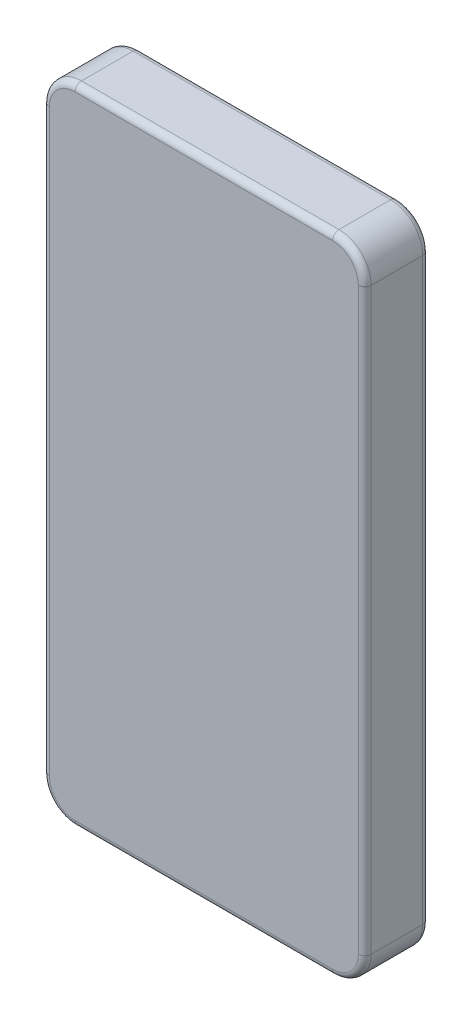
ISO-10303-21;
HEADER;
FILE_DESCRIPTION(('STEP AP214'),'2;1');
FILE_NAME('part.step','',(''),(''),'','','');
FILE_SCHEMA(('AUTOMOTIVE_DESIGN { 1 0 10303 214 1 1 1 1 }'));
ENDSEC;
DATA;
#1=APPLICATION_CONTEXT('core data for automotive mechanical design processes');
#2=APPLICATION_PROTOCOL_DEFINITION('international standard','automotive_design',2000,#1);
#3=PRODUCT_CONTEXT('',#1,'mechanical');
#4=PRODUCT('Part','Part','',(#3));
#5=PRODUCT_RELATED_PRODUCT_CATEGORY('part','',(#4));
#6=PRODUCT_DEFINITION_FORMATION('','',#4);
#7=PRODUCT_DEFINITION_CONTEXT('part definition',#1,'design');
#8=PRODUCT_DEFINITION('design','',#6,#7);
#9=PRODUCT_DEFINITION_SHAPE('','',#8);
#10=(LENGTH_UNIT() NAMED_UNIT(*) SI_UNIT(.MILLI.,.METRE.));
#11=(NAMED_UNIT(*) PLANE_ANGLE_UNIT() SI_UNIT($,.RADIAN.));
#12=(NAMED_UNIT(*) SI_UNIT($,.STERADIAN.) SOLID_ANGLE_UNIT());
#13=UNCERTAINTY_MEASURE_WITH_UNIT(LENGTH_MEASURE(1.E-05),#10,'distance_accuracy_value','');
#14=(GEOMETRIC_REPRESENTATION_CONTEXT(3) GLOBAL_UNCERTAINTY_ASSIGNED_CONTEXT((#13)) GLOBAL_UNIT_ASSIGNED_CONTEXT((#10,
#11,#12)) REPRESENTATION_CONTEXT('',''));
#15=CARTESIAN_POINT('',(0.,0.,0.));
#16=DIRECTION('',(0.,0.,1.));
#17=DIRECTION('',(1.,0.,0.));
#18=AXIS2_PLACEMENT_3D('',#15,#16,#17);
#19=CARTESIAN_POINT('',(-0.25,0.5,0.05));
#20=DIRECTION('',(1.,0.,0.));
#21=DIRECTION('',(0.,1.,0.));
#22=AXIS2_PLACEMENT_3D('',#19,#20,#21);
#23=PLANE('',#22);
#24=DIRECTION('',(0.,0.,-1.));
#25=VECTOR('',#24,1.);
#26=CARTESIAN_POINT('',(-0.25,0.45,0.05));
#27=LINE('',#26,#25);
#28=CARTESIAN_POINT('',(-0.25,0.45,0.04));
#29=VERTEX_POINT('',#28);
#30=CARTESIAN_POINT('',(-0.25,0.45,-0.04));
#31=VERTEX_POINT('',#30);
#32=EDGE_CURVE('E337',#29,#31,#27,.T.);
#33=ORIENTED_EDGE('',*,*,#32,.T.);
#34=DIRECTION('',(0.,-1.,0.));
#35=VECTOR('',#34,1.);
#36=CARTESIAN_POINT('',(-0.25,0.5,-0.04));
#37=LINE('',#36,#35);
#38=CARTESIAN_POINT('',(-0.25,-0.45,-0.04));
#39=VERTEX_POINT('',#38);
#40=EDGE_CURVE('E224',#31,#39,#37,.T.);
#41=ORIENTED_EDGE('',*,*,#40,.T.);
#42=DIRECTION('',(0.,0.,-1.));
#43=VECTOR('',#42,1.);
#44=CARTESIAN_POINT('',(-0.25,-0.45,0.05));
#45=LINE('',#44,#43);
#46=CARTESIAN_POINT('',(-0.25,-0.45,0.04));
#47=VERTEX_POINT('',#46);
#48=EDGE_CURVE('E343',#39,#47,#45,.F.);
#49=ORIENTED_EDGE('',*,*,#48,.T.);
#50=DIRECTION('',(0.,-1.,0.));
#51=VECTOR('',#50,1.);
#52=CARTESIAN_POINT('',(-0.25,0.45,0.04));
#53=LINE('',#52,#51);
#54=EDGE_CURVE('E221',#47,#29,#53,.F.);
#55=ORIENTED_EDGE('',*,*,#54,.T.);
#56=EDGE_LOOP('',(#33,#41,#49,#55));
#57=FACE_BOUND('',#56,.T.);
#58=ADVANCED_FACE('F42',(#57),#23,.F.);
#59=CARTESIAN_POINT('',(-0.25,-0.5,0.05));
#60=DIRECTION('',(0.,1.,0.));
#61=DIRECTION('',(0.,0.,1.));
#62=AXIS2_PLACEMENT_3D('',#59,#60,#61);
#63=PLANE('',#62);
#64=DIRECTION('',(0.,0.,-1.));
#65=VECTOR('',#64,1.);
#66=CARTESIAN_POINT('',(-0.2,-0.5,0.05));
#67=LINE('',#66,#65);
#68=CARTESIAN_POINT('',(-0.2,-0.5,0.04));
#69=VERTEX_POINT('',#68);
#70=CARTESIAN_POINT('',(-0.2,-0.5,-0.04));
#71=VERTEX_POINT('',#70);
#72=EDGE_CURVE('E334',#69,#71,#67,.T.);
#73=ORIENTED_EDGE('',*,*,#72,.T.);
#74=DIRECTION('',(1.,0.,0.));
#75=VECTOR('',#74,1.);
#76=CARTESIAN_POINT('',(-0.25,-0.5,-0.04));
#77=LINE('',#76,#75);
#78=CARTESIAN_POINT('',(0.2,-0.5,-0.04));
#79=VERTEX_POINT('',#78);
#80=EDGE_CURVE('E236',#71,#79,#77,.T.);
#81=ORIENTED_EDGE('',*,*,#80,.T.);
#82=DIRECTION('',(0.,0.,-1.));
#83=VECTOR('',#82,1.);
#84=CARTESIAN_POINT('',(0.2,-0.5,0.05));
#85=LINE('',#84,#83);
#86=CARTESIAN_POINT('',(0.2,-0.5,0.04));
#87=VERTEX_POINT('',#86);
#88=EDGE_CURVE('E282',#79,#87,#85,.F.);
#89=ORIENTED_EDGE('',*,*,#88,.T.);
#90=DIRECTION('',(1.,0.,0.));
#91=VECTOR('',#90,1.);
#92=CARTESIAN_POINT('',(-0.2,-0.5,0.04));
#93=LINE('',#92,#91);
#94=EDGE_CURVE('E233',#87,#69,#93,.F.);
#95=ORIENTED_EDGE('',*,*,#94,.T.);
#96=EDGE_LOOP('',(#73,#81,#89,#95));
#97=FACE_BOUND('',#96,.T.);
#98=ADVANCED_FACE('F331',(#97),#63,.F.);
#99=CARTESIAN_POINT('',(0.25,0.5,0.05));
#100=DIRECTION('',(-1.,0.,0.));
#101=DIRECTION('',(0.,-1.,0.));
#102=AXIS2_PLACEMENT_3D('',#99,#100,#101);
#103=PLANE('',#102);
#104=DIRECTION('',(0.,0.,-1.));
#105=VECTOR('',#104,1.);
#106=CARTESIAN_POINT('',(0.25,-0.45,0.05));
#107=LINE('',#106,#105);
#108=CARTESIAN_POINT('',(0.25,-0.45,0.04));
#109=VERTEX_POINT('',#108);
#110=CARTESIAN_POINT('',(0.25,-0.45,-0.04));
#111=VERTEX_POINT('',#110);
#112=EDGE_CURVE('E328',#109,#111,#107,.T.);
#113=ORIENTED_EDGE('',*,*,#112,.T.);
#114=DIRECTION('',(0.,1.,0.));
#115=VECTOR('',#114,1.);
#116=CARTESIAN_POINT('',(0.25,0.5,-0.04));
#117=LINE('',#116,#115);
#118=CARTESIAN_POINT('',(0.25,0.45,-0.04));
#119=VERTEX_POINT('',#118);
#120=EDGE_CURVE('E199',#111,#119,#117,.T.);
#121=ORIENTED_EDGE('',*,*,#120,.T.);
#122=DIRECTION('',(0.,0.,-1.));
#123=VECTOR('',#122,1.);
#124=CARTESIAN_POINT('',(0.25,0.45,0.05));
#125=LINE('',#124,#123);
#126=CARTESIAN_POINT('',(0.25,0.45,0.04));
#127=VERTEX_POINT('',#126);
#128=EDGE_CURVE('E347',#119,#127,#125,.F.);
#129=ORIENTED_EDGE('',*,*,#128,.T.);
#130=DIRECTION('',(0.,1.,0.));
#131=VECTOR('',#130,1.);
#132=CARTESIAN_POINT('',(0.25,-0.45,0.04));
#133=LINE('',#132,#131);
#134=EDGE_CURVE('E196',#127,#109,#133,.F.);
#135=ORIENTED_EDGE('',*,*,#134,.T.);
#136=EDGE_LOOP('',(#113,#121,#129,#135));
#137=FACE_BOUND('',#136,.T.);
#138=ADVANCED_FACE('F383',(#137),#103,.F.);
#139=CARTESIAN_POINT('',(-0.25,0.5,0.05));
#140=DIRECTION('',(0.,-1.,0.));
#141=DIRECTION('',(0.,0.,-1.));
#142=AXIS2_PLACEMENT_3D('',#139,#140,#141);
#143=PLANE('',#142);
#144=DIRECTION('',(0.,0.,-1.));
#145=VECTOR('',#144,1.);
#146=CARTESIAN_POINT('',(0.2,0.5,0.05));
#147=LINE('',#146,#145);
#148=CARTESIAN_POINT('',(0.2,0.5,0.04));
#149=VERTEX_POINT('',#148);
#150=CARTESIAN_POINT('',(0.2,0.5,-0.04));
#151=VERTEX_POINT('',#150);
#152=EDGE_CURVE('E353',#149,#151,#147,.T.);
#153=ORIENTED_EDGE('',*,*,#152,.T.);
#154=DIRECTION('',(-1.,0.,0.));
#155=VECTOR('',#154,1.);
#156=CARTESIAN_POINT('',(-0.25,0.5,-0.04));
#157=LINE('',#156,#155);
#158=CARTESIAN_POINT('',(-0.2,0.5,-0.04));
#159=VERTEX_POINT('',#158);
#160=EDGE_CURVE('E211',#151,#159,#157,.T.);
#161=ORIENTED_EDGE('',*,*,#160,.T.);
#162=DIRECTION('',(0.,0.,-1.));
#163=VECTOR('',#162,1.);
#164=CARTESIAN_POINT('',(-0.2,0.5,0.05));
#165=LINE('',#164,#163);
#166=CARTESIAN_POINT('',(-0.2,0.5,0.04));
#167=VERTEX_POINT('',#166);
#168=EDGE_CURVE('E178',#159,#167,#165,.F.);
#169=ORIENTED_EDGE('',*,*,#168,.T.);
#170=DIRECTION('',(-1.,0.,0.));
#171=VECTOR('',#170,1.);
#172=CARTESIAN_POINT('',(0.2,0.5,0.04));
#173=LINE('',#172,#171);
#174=EDGE_CURVE('E208',#167,#149,#173,.F.);
#175=ORIENTED_EDGE('',*,*,#174,.T.);
#176=EDGE_LOOP('',(#153,#161,#169,#175));
#177=FACE_BOUND('',#176,.T.);
#178=ADVANCED_FACE('F426',(#177),#143,.F.);
#179=CARTESIAN_POINT('',(0.,0.,0.05));
#180=DIRECTION('',(0.,0.,1.));
#181=DIRECTION('',(1.,0.,0.));
#182=AXIS2_PLACEMENT_3D('',#179,#180,#181);
#183=PLANE('',#182);
#184=DIRECTION('',(-1.,0.,0.));
#185=VECTOR('',#184,1.);
#186=CARTESIAN_POINT('',(-0.2,0.49,0.05));
#187=LINE('',#186,#185);
#188=CARTESIAN_POINT('',(0.2,0.49,0.05));
#189=VERTEX_POINT('',#188);
#190=CARTESIAN_POINT('',(-0.2,0.49,0.05));
#191=VERTEX_POINT('',#190);
#192=EDGE_CURVE('E52',#189,#191,#187,.T.);
#193=ORIENTED_EDGE('',*,*,#192,.T.);
#194=CARTESIAN_POINT('',(-0.2,0.45,0.05));
#195=DIRECTION('',(0.,0.,1.));
#196=DIRECTION('',(1.,0.,0.));
#197=AXIS2_PLACEMENT_3D('',#194,#195,#196);
#198=CIRCLE('',#197,0.04);
#199=CARTESIAN_POINT('',(-0.24,0.45,0.05));
#200=VERTEX_POINT('',#199);
#201=EDGE_CURVE('E11',#191,#200,#198,.T.);
#202=ORIENTED_EDGE('',*,*,#201,.T.);
#203=DIRECTION('',(0.,-1.,0.));
#204=VECTOR('',#203,1.);
#205=CARTESIAN_POINT('',(-0.24,-0.45,0.05));
#206=LINE('',#205,#204);
#207=CARTESIAN_POINT('',(-0.24,-0.45,0.05));
#208=VERTEX_POINT('',#207);
#209=EDGE_CURVE('E239',#200,#208,#206,.T.);
#210=ORIENTED_EDGE('',*,*,#209,.T.);
#211=CARTESIAN_POINT('',(-0.2,-0.45,0.05));
#212=DIRECTION('',(0.,0.,1.));
#213=DIRECTION('',(1.,0.,0.));
#214=AXIS2_PLACEMENT_3D('',#211,#212,#213);
#215=CIRCLE('',#214,0.04);
#216=CARTESIAN_POINT('',(-0.2,-0.49,0.05));
#217=VERTEX_POINT('',#216);
#218=EDGE_CURVE('E242',#208,#217,#215,.T.);
#219=ORIENTED_EDGE('',*,*,#218,.T.);
#220=DIRECTION('',(1.,0.,0.));
#221=VECTOR('',#220,1.);
#222=CARTESIAN_POINT('',(0.2,-0.49,0.05));
#223=LINE('',#222,#221);
#224=CARTESIAN_POINT('',(0.2,-0.49,0.05));
#225=VERTEX_POINT('',#224);
#226=EDGE_CURVE('E245',#217,#225,#223,.T.);
#227=ORIENTED_EDGE('',*,*,#226,.T.);
#228=CARTESIAN_POINT('',(0.2,-0.45,0.05));
#229=DIRECTION('',(0.,0.,1.));
#230=DIRECTION('',(1.,0.,0.));
#231=AXIS2_PLACEMENT_3D('',#228,#229,#230);
#232=CIRCLE('',#231,0.04);
#233=CARTESIAN_POINT('',(0.24,-0.45,0.05));
#234=VERTEX_POINT('',#233);
#235=EDGE_CURVE('E248',#225,#234,#232,.T.);
#236=ORIENTED_EDGE('',*,*,#235,.T.);
#237=DIRECTION('',(0.,1.,0.));
#238=VECTOR('',#237,1.);
#239=CARTESIAN_POINT('',(0.24,0.45,0.05));
#240=LINE('',#239,#238);
#241=CARTESIAN_POINT('',(0.24,0.45,0.05));
#242=VERTEX_POINT('',#241);
#243=EDGE_CURVE('E251',#234,#242,#240,.T.);
#244=ORIENTED_EDGE('',*,*,#243,.T.);
#245=CARTESIAN_POINT('',(0.2,0.45,0.05));
#246=DIRECTION('',(0.,0.,1.));
#247=DIRECTION('',(1.,0.,0.));
#248=AXIS2_PLACEMENT_3D('',#245,#246,#247);
#249=CIRCLE('',#248,0.04);
#250=EDGE_CURVE('E63',#242,#189,#249,.T.);
#251=ORIENTED_EDGE('',*,*,#250,.T.);
#252=EDGE_LOOP('',(#193,#202,#210,#219,#227,#236,#244,#251));
#253=FACE_BOUND('',#252,.T.);
#254=ADVANCED_FACE('F399',(#253),#183,.T.);
#255=CARTESIAN_POINT('',(0.,0.,-0.05));
#256=DIRECTION('',(0.,0.,1.));
#257=DIRECTION('',(1.,0.,0.));
#258=AXIS2_PLACEMENT_3D('',#255,#256,#257);
#259=PLANE('',#258);
#260=DIRECTION('',(0.,1.,0.));
#261=VECTOR('',#260,1.);
#262=CARTESIAN_POINT('',(0.24,0.,-0.05));
#263=LINE('',#262,#261);
#264=CARTESIAN_POINT('',(0.24,0.45,-0.05));
#265=VERTEX_POINT('',#264);
#266=CARTESIAN_POINT('',(0.24,-0.45,-0.05));
#267=VERTEX_POINT('',#266);
#268=EDGE_CURVE('E182',#265,#267,#263,.F.);
#269=ORIENTED_EDGE('',*,*,#268,.T.);
#270=CARTESIAN_POINT('',(0.2,-0.45,-0.05));
#271=DIRECTION('',(0.,0.,1.));
#272=DIRECTION('',(1.,0.,0.));
#273=AXIS2_PLACEMENT_3D('',#270,#271,#272);
#274=CIRCLE('',#273,0.04);
#275=CARTESIAN_POINT('',(0.2,-0.49,-0.05));
#276=VERTEX_POINT('',#275);
#277=EDGE_CURVE('E161',#267,#276,#274,.F.);
#278=ORIENTED_EDGE('',*,*,#277,.T.);
#279=DIRECTION('',(1.,0.,0.));
#280=VECTOR('',#279,1.);
#281=CARTESIAN_POINT('',(0.,-0.49,-0.05));
#282=LINE('',#281,#280);
#283=CARTESIAN_POINT('',(-0.2,-0.49,-0.05));
#284=VERTEX_POINT('',#283);
#285=EDGE_CURVE('E170',#276,#284,#282,.F.);
#286=ORIENTED_EDGE('',*,*,#285,.T.);
#287=CARTESIAN_POINT('',(-0.2,-0.45,-0.05));
#288=DIRECTION('',(0.,0.,1.));
#289=DIRECTION('',(1.,0.,0.));
#290=AXIS2_PLACEMENT_3D('',#287,#288,#289);
#291=CIRCLE('',#290,0.04);
#292=CARTESIAN_POINT('',(-0.24,-0.45,-0.05));
#293=VERTEX_POINT('',#292);
#294=EDGE_CURVE('E177',#284,#293,#291,.F.);
#295=ORIENTED_EDGE('',*,*,#294,.T.);
#296=DIRECTION('',(0.,-1.,0.));
#297=VECTOR('',#296,1.);
#298=CARTESIAN_POINT('',(-0.24,0.,-0.05));
#299=LINE('',#298,#297);
#300=CARTESIAN_POINT('',(-0.24,0.45,-0.05));
#301=VERTEX_POINT('',#300);
#302=EDGE_CURVE('E362',#293,#301,#299,.F.);
#303=ORIENTED_EDGE('',*,*,#302,.T.);
#304=CARTESIAN_POINT('',(-0.2,0.45,-0.05));
#305=DIRECTION('',(0.,0.,1.));
#306=DIRECTION('',(1.,0.,0.));
#307=AXIS2_PLACEMENT_3D('',#304,#305,#306);
#308=CIRCLE('',#307,0.04);
#309=CARTESIAN_POINT('',(-0.2,0.49,-0.05));
#310=VERTEX_POINT('',#309);
#311=EDGE_CURVE('E365',#301,#310,#308,.F.);
#312=ORIENTED_EDGE('',*,*,#311,.T.);
#313=DIRECTION('',(-1.,0.,0.));
#314=VECTOR('',#313,1.);
#315=CARTESIAN_POINT('',(0.,0.49,-0.05));
#316=LINE('',#315,#314);
#317=CARTESIAN_POINT('',(0.2,0.49,-0.05));
#318=VERTEX_POINT('',#317);
#319=EDGE_CURVE('E368',#310,#318,#316,.F.);
#320=ORIENTED_EDGE('',*,*,#319,.T.);
#321=CARTESIAN_POINT('',(0.2,0.45,-0.05));
#322=DIRECTION('',(0.,0.,1.));
#323=DIRECTION('',(1.,0.,0.));
#324=AXIS2_PLACEMENT_3D('',#321,#322,#323);
#325=CIRCLE('',#324,0.04);
#326=EDGE_CURVE('E190',#318,#265,#325,.F.);
#327=ORIENTED_EDGE('',*,*,#326,.T.);
#328=EDGE_LOOP('',(#269,#278,#286,#295,#303,#312,#320,#327));
#329=FACE_BOUND('',#328,.T.);
#330=ADVANCED_FACE('F180',(#329),#259,.F.);
#331=CARTESIAN_POINT('',(-0.2,-0.45,0.05));
#332=DIRECTION('',(0.,0.,-1.));
#333=DIRECTION('',(-1.,0.,0.));
#334=AXIS2_PLACEMENT_3D('',#331,#332,#333);
#335=CYLINDRICAL_SURFACE('',#334,0.05);
#336=ORIENTED_EDGE('',*,*,#48,.F.);
#337=CARTESIAN_POINT('',(-0.2,-0.45,-0.04));
#338=DIRECTION('',(0.,0.,1.));
#339=DIRECTION('',(1.,0.,0.));
#340=AXIS2_PLACEMENT_3D('',#337,#338,#339);
#341=CIRCLE('',#340,0.05);
#342=EDGE_CURVE('E230',#39,#71,#341,.T.);
#343=ORIENTED_EDGE('',*,*,#342,.T.);
#344=ORIENTED_EDGE('',*,*,#72,.F.);
#345=CARTESIAN_POINT('',(-0.2,-0.45,0.04));
#346=DIRECTION('',(0.,0.,1.));
#347=DIRECTION('',(1.,0.,0.));
#348=AXIS2_PLACEMENT_3D('',#345,#346,#347);
#349=CIRCLE('',#348,0.05);
#350=EDGE_CURVE('E227',#69,#47,#349,.F.);
#351=ORIENTED_EDGE('',*,*,#350,.T.);
#352=EDGE_LOOP('',(#336,#343,#344,#351));
#353=FACE_BOUND('',#352,.T.);
#354=ADVANCED_FACE('F443',(#353),#335,.T.);
#355=CARTESIAN_POINT('',(0.2,-0.45,0.05));
#356=DIRECTION('',(0.,0.,-1.));
#357=DIRECTION('',(-1.,0.,0.));
#358=AXIS2_PLACEMENT_3D('',#355,#356,#357);
#359=CYLINDRICAL_SURFACE('',#358,0.05);
#360=ORIENTED_EDGE('',*,*,#88,.F.);
#361=CARTESIAN_POINT('',(0.2,-0.45,-0.04));
#362=DIRECTION('',(0.,0.,1.));
#363=DIRECTION('',(1.,0.,0.));
#364=AXIS2_PLACEMENT_3D('',#361,#362,#363);
#365=CIRCLE('',#364,0.05);
#366=EDGE_CURVE('E163',#79,#111,#365,.T.);
#367=ORIENTED_EDGE('',*,*,#366,.T.);
#368=ORIENTED_EDGE('',*,*,#112,.F.);
#369=CARTESIAN_POINT('',(0.2,-0.45,0.04));
#370=DIRECTION('',(0.,0.,1.));
#371=DIRECTION('',(1.,0.,0.));
#372=AXIS2_PLACEMENT_3D('',#369,#370,#371);
#373=CIRCLE('',#372,0.05);
#374=EDGE_CURVE('E185',#109,#87,#373,.F.);
#375=ORIENTED_EDGE('',*,*,#374,.T.);
#376=EDGE_LOOP('',(#360,#367,#368,#375));
#377=FACE_BOUND('',#376,.T.);
#378=ADVANCED_FACE('F326',(#377),#359,.T.);
#379=CARTESIAN_POINT('',(-0.2,0.45,0.05));
#380=DIRECTION('',(0.,0.,-1.));
#381=DIRECTION('',(-1.,0.,0.));
#382=AXIS2_PLACEMENT_3D('',#379,#380,#381);
#383=CYLINDRICAL_SURFACE('',#382,0.05);
#384=ORIENTED_EDGE('',*,*,#168,.F.);
#385=CARTESIAN_POINT('',(-0.2,0.45,-0.04));
#386=DIRECTION('',(0.,0.,1.));
#387=DIRECTION('',(1.,0.,0.));
#388=AXIS2_PLACEMENT_3D('',#385,#386,#387);
#389=CIRCLE('',#388,0.05);
#390=EDGE_CURVE('E218',#159,#31,#389,.T.);
#391=ORIENTED_EDGE('',*,*,#390,.T.);
#392=ORIENTED_EDGE('',*,*,#32,.F.);
#393=CARTESIAN_POINT('',(-0.2,0.45,0.04));
#394=DIRECTION('',(0.,0.,1.));
#395=DIRECTION('',(1.,0.,0.));
#396=AXIS2_PLACEMENT_3D('',#393,#394,#395);
#397=CIRCLE('',#396,0.05);
#398=EDGE_CURVE('E214',#29,#167,#397,.F.);
#399=ORIENTED_EDGE('',*,*,#398,.T.);
#400=EDGE_LOOP('',(#384,#391,#392,#399));
#401=FACE_BOUND('',#400,.T.);
#402=ADVANCED_FACE('F415',(#401),#383,.T.);
#403=CARTESIAN_POINT('',(0.2,0.45,0.05));
#404=DIRECTION('',(0.,0.,-1.));
#405=DIRECTION('',(-1.,0.,0.));
#406=AXIS2_PLACEMENT_3D('',#403,#404,#405);
#407=CYLINDRICAL_SURFACE('',#406,0.05);
#408=ORIENTED_EDGE('',*,*,#128,.F.);
#409=CARTESIAN_POINT('',(0.2,0.45,-0.04));
#410=DIRECTION('',(0.,0.,1.));
#411=DIRECTION('',(1.,0.,0.));
#412=AXIS2_PLACEMENT_3D('',#409,#410,#411);
#413=CIRCLE('',#412,0.05);
#414=EDGE_CURVE('E205',#119,#151,#413,.T.);
#415=ORIENTED_EDGE('',*,*,#414,.T.);
#416=ORIENTED_EDGE('',*,*,#152,.F.);
#417=CARTESIAN_POINT('',(0.2,0.45,0.04));
#418=DIRECTION('',(0.,0.,1.));
#419=DIRECTION('',(1.,0.,0.));
#420=AXIS2_PLACEMENT_3D('',#417,#418,#419);
#421=CIRCLE('',#420,0.05);
#422=EDGE_CURVE('E202',#149,#127,#421,.F.);
#423=ORIENTED_EDGE('',*,*,#422,.T.);
#424=EDGE_LOOP('',(#408,#415,#416,#423));
#425=FACE_BOUND('',#424,.T.);
#426=ADVANCED_FACE('F385',(#425),#407,.T.);
#427=CARTESIAN_POINT('',(-0.2,0.45,-0.04));
#428=DIRECTION('',(0.,0.,1.));
#429=DIRECTION('',(1.,0.,0.));
#430=AXIS2_PLACEMENT_3D('',#427,#428,#429);
#431=TOROIDAL_SURFACE('',#430,0.04,0.01);
#432=CARTESIAN_POINT('',(-0.24,0.45,-0.04));
#433=DIRECTION('',(0.,-1.,0.));
#434=DIRECTION('',(0.,0.,-1.));
#435=AXIS2_PLACEMENT_3D('',#432,#433,#434);
#436=CIRCLE('',#435,0.01);
#437=EDGE_CURVE('E274',#31,#301,#436,.T.);
#438=ORIENTED_EDGE('',*,*,#437,.F.);
#439=ORIENTED_EDGE('',*,*,#390,.F.);
#440=CARTESIAN_POINT('',(-0.2,0.49,-0.04));
#441=DIRECTION('',(1.,0.,0.));
#442=DIRECTION('',(0.,0.,-1.));
#443=AXIS2_PLACEMENT_3D('',#440,#441,#442);
#444=CIRCLE('',#443,0.01);
#445=EDGE_CURVE('E278',#310,#159,#444,.T.);
#446=ORIENTED_EDGE('',*,*,#445,.F.);
#447=ORIENTED_EDGE('',*,*,#311,.F.);
#448=EDGE_LOOP('',(#438,#439,#446,#447));
#449=FACE_BOUND('',#448,.T.);
#450=ADVANCED_FACE('F419',(#449),#431,.T.);
#451=CARTESIAN_POINT('',(-0.25,0.49,-0.04));
#452=DIRECTION('',(-1.,0.,0.));
#453=DIRECTION('',(0.,0.,1.));
#454=AXIS2_PLACEMENT_3D('',#451,#452,#453);
#455=CYLINDRICAL_SURFACE('',#454,0.01);
#456=ORIENTED_EDGE('',*,*,#445,.T.);
#457=ORIENTED_EDGE('',*,*,#160,.F.);
#458=CARTESIAN_POINT('',(0.2,0.49,-0.04));
#459=DIRECTION('',(1.,0.,0.));
#460=DIRECTION('',(0.,0.,-1.));
#461=AXIS2_PLACEMENT_3D('',#458,#459,#460);
#462=CIRCLE('',#461,0.01);
#463=EDGE_CURVE('E270',#318,#151,#462,.T.);
#464=ORIENTED_EDGE('',*,*,#463,.F.);
#465=ORIENTED_EDGE('',*,*,#319,.F.);
#466=EDGE_LOOP('',(#456,#457,#464,#465));
#467=FACE_BOUND('',#466,.T.);
#468=ADVANCED_FACE('F424',(#467),#455,.T.);
#469=CARTESIAN_POINT('',(-0.24,0.5,-0.04));
#470=DIRECTION('',(0.,-1.,0.));
#471=DIRECTION('',(1.,0.,0.));
#472=AXIS2_PLACEMENT_3D('',#469,#470,#471);
#473=CYLINDRICAL_SURFACE('',#472,0.01);
#474=ORIENTED_EDGE('',*,*,#437,.T.);
#475=ORIENTED_EDGE('',*,*,#302,.F.);
#476=CARTESIAN_POINT('',(-0.24,-0.45,-0.04));
#477=DIRECTION('',(0.,-1.,0.));
#478=DIRECTION('',(0.,0.,-1.));
#479=AXIS2_PLACEMENT_3D('',#476,#477,#478);
#480=CIRCLE('',#479,0.01);
#481=EDGE_CURVE('E266',#39,#293,#480,.T.);
#482=ORIENTED_EDGE('',*,*,#481,.F.);
#483=ORIENTED_EDGE('',*,*,#40,.F.);
#484=EDGE_LOOP('',(#474,#475,#482,#483));
#485=FACE_BOUND('',#484,.T.);
#486=ADVANCED_FACE('F465',(#485),#473,.T.);
#487=CARTESIAN_POINT('',(0.2,0.45,-0.04));
#488=DIRECTION('',(0.,0.,1.));
#489=DIRECTION('',(1.,0.,0.));
#490=AXIS2_PLACEMENT_3D('',#487,#488,#489);
#491=TOROIDAL_SURFACE('',#490,0.04,0.01);
#492=ORIENTED_EDGE('',*,*,#463,.T.);
#493=ORIENTED_EDGE('',*,*,#414,.F.);
#494=CARTESIAN_POINT('',(0.24,0.45,-0.04));
#495=DIRECTION('',(0.,-1.,0.));
#496=DIRECTION('',(0.,0.,-1.));
#497=AXIS2_PLACEMENT_3D('',#494,#495,#496);
#498=CIRCLE('',#497,0.01);
#499=EDGE_CURVE('E262',#265,#119,#498,.T.);
#500=ORIENTED_EDGE('',*,*,#499,.F.);
#501=ORIENTED_EDGE('',*,*,#326,.F.);
#502=EDGE_LOOP('',(#492,#493,#500,#501));
#503=FACE_BOUND('',#502,.T.);
#504=ADVANCED_FACE('F377',(#503),#491,.T.);
#505=CARTESIAN_POINT('',(-0.2,-0.45,-0.04));
#506=DIRECTION('',(0.,0.,1.));
#507=DIRECTION('',(1.,0.,0.));
#508=AXIS2_PLACEMENT_3D('',#505,#506,#507);
#509=TOROIDAL_SURFACE('',#508,0.04,0.01);
#510=ORIENTED_EDGE('',*,*,#481,.T.);
#511=ORIENTED_EDGE('',*,*,#294,.F.);
#512=CARTESIAN_POINT('',(-0.2,-0.49,-0.04));
#513=DIRECTION('',(1.,0.,0.));
#514=DIRECTION('',(0.,0.,-1.));
#515=AXIS2_PLACEMENT_3D('',#512,#513,#514);
#516=CIRCLE('',#515,0.01);
#517=EDGE_CURVE('E173',#71,#284,#516,.T.);
#518=ORIENTED_EDGE('',*,*,#517,.F.);
#519=ORIENTED_EDGE('',*,*,#342,.F.);
#520=EDGE_LOOP('',(#510,#511,#518,#519));
#521=FACE_BOUND('',#520,.T.);
#522=ADVANCED_FACE('F459',(#521),#509,.T.);
#523=CARTESIAN_POINT('',(0.24,0.5,-0.04));
#524=DIRECTION('',(0.,1.,0.));
#525=DIRECTION('',(-1.,0.,0.));
#526=AXIS2_PLACEMENT_3D('',#523,#524,#525);
#527=CYLINDRICAL_SURFACE('',#526,0.01);
#528=ORIENTED_EDGE('',*,*,#499,.T.);
#529=ORIENTED_EDGE('',*,*,#120,.F.);
#530=CARTESIAN_POINT('',(0.24,-0.45,-0.04));
#531=DIRECTION('',(0.,-1.,0.));
#532=DIRECTION('',(0.,0.,-1.));
#533=AXIS2_PLACEMENT_3D('',#530,#531,#532);
#534=CIRCLE('',#533,0.01);
#535=EDGE_CURVE('E167',#267,#111,#534,.T.);
#536=ORIENTED_EDGE('',*,*,#535,.F.);
#537=ORIENTED_EDGE('',*,*,#268,.F.);
#538=EDGE_LOOP('',(#528,#529,#536,#537));
#539=FACE_BOUND('',#538,.T.);
#540=ADVANCED_FACE('F380',(#539),#527,.T.);
#541=CARTESIAN_POINT('',(-0.25,-0.49,-0.04));
#542=DIRECTION('',(1.,0.,0.));
#543=DIRECTION('',(0.,0.,-1.));
#544=AXIS2_PLACEMENT_3D('',#541,#542,#543);
#545=CYLINDRICAL_SURFACE('',#544,0.01);
#546=ORIENTED_EDGE('',*,*,#517,.T.);
#547=ORIENTED_EDGE('',*,*,#285,.F.);
#548=CARTESIAN_POINT('',(0.2,-0.49,-0.04));
#549=DIRECTION('',(1.,0.,0.));
#550=DIRECTION('',(0.,0.,-1.));
#551=AXIS2_PLACEMENT_3D('',#548,#549,#550);
#552=CIRCLE('',#551,0.01);
#553=EDGE_CURVE('E157',#79,#276,#552,.T.);
#554=ORIENTED_EDGE('',*,*,#553,.F.);
#555=ORIENTED_EDGE('',*,*,#80,.F.);
#556=EDGE_LOOP('',(#546,#547,#554,#555));
#557=FACE_BOUND('',#556,.T.);
#558=ADVANCED_FACE('F171',(#557),#545,.T.);
#559=CARTESIAN_POINT('',(0.2,-0.45,-0.04));
#560=DIRECTION('',(0.,0.,1.));
#561=DIRECTION('',(1.,0.,0.));
#562=AXIS2_PLACEMENT_3D('',#559,#560,#561);
#563=TOROIDAL_SURFACE('',#562,0.04,0.01);
#564=ORIENTED_EDGE('',*,*,#535,.T.);
#565=ORIENTED_EDGE('',*,*,#366,.F.);
#566=ORIENTED_EDGE('',*,*,#553,.T.);
#567=ORIENTED_EDGE('',*,*,#277,.F.);
#568=EDGE_LOOP('',(#564,#565,#566,#567));
#569=FACE_BOUND('',#568,.T.);
#570=ADVANCED_FACE('F159',(#569),#563,.T.);
#571=CARTESIAN_POINT('',(0.2,-0.45,0.04));
#572=DIRECTION('',(0.,0.,1.));
#573=DIRECTION('',(1.,0.,0.));
#574=AXIS2_PLACEMENT_3D('',#571,#572,#573);
#575=TOROIDAL_SURFACE('',#574,0.04,0.01);
#576=CARTESIAN_POINT('',(0.2,-0.49,0.04));
#577=DIRECTION('',(-1.,0.,0.));
#578=DIRECTION('',(0.,0.,1.));
#579=AXIS2_PLACEMENT_3D('',#576,#577,#578);
#580=CIRCLE('',#579,0.01);
#581=EDGE_CURVE('E304',#87,#225,#580,.T.);
#582=ORIENTED_EDGE('',*,*,#581,.F.);
#583=ORIENTED_EDGE('',*,*,#374,.F.);
#584=CARTESIAN_POINT('',(0.24,-0.45,0.04));
#585=DIRECTION('',(0.,1.,0.));
#586=DIRECTION('',(0.,0.,1.));
#587=AXIS2_PLACEMENT_3D('',#584,#585,#586);
#588=CIRCLE('',#587,0.01);
#589=EDGE_CURVE('E46',#234,#109,#588,.T.);
#590=ORIENTED_EDGE('',*,*,#589,.F.);
#591=ORIENTED_EDGE('',*,*,#235,.F.);
#592=EDGE_LOOP('',(#582,#583,#590,#591));
#593=FACE_BOUND('',#592,.T.);
#594=ADVANCED_FACE('F44',(#593),#575,.T.);
#595=CARTESIAN_POINT('',(0.24,0.,0.04));
#596=DIRECTION('',(0.,-1.,0.));
#597=DIRECTION('',(1.,0.,0.));
#598=AXIS2_PLACEMENT_3D('',#595,#596,#597);
#599=CYLINDRICAL_SURFACE('',#598,0.01);
#600=ORIENTED_EDGE('',*,*,#589,.T.);
#601=ORIENTED_EDGE('',*,*,#134,.F.);
#602=CARTESIAN_POINT('',(0.24,0.45,0.04));
#603=DIRECTION('',(0.,1.,0.));
#604=DIRECTION('',(0.,0.,1.));
#605=AXIS2_PLACEMENT_3D('',#602,#603,#604);
#606=CIRCLE('',#605,0.01);
#607=EDGE_CURVE('E301',#242,#127,#606,.T.);
#608=ORIENTED_EDGE('',*,*,#607,.F.);
#609=ORIENTED_EDGE('',*,*,#243,.F.);
#610=EDGE_LOOP('',(#600,#601,#608,#609));
#611=FACE_BOUND('',#610,.T.);
#612=ADVANCED_FACE('F317',(#611),#599,.T.);
#613=CARTESIAN_POINT('',(0.,-0.49,0.04));
#614=DIRECTION('',(-1.,0.,0.));
#615=DIRECTION('',(0.,0.,1.));
#616=AXIS2_PLACEMENT_3D('',#613,#614,#615);
#617=CYLINDRICAL_SURFACE('',#616,0.01);
#618=ORIENTED_EDGE('',*,*,#581,.T.);
#619=ORIENTED_EDGE('',*,*,#226,.F.);
#620=CARTESIAN_POINT('',(-0.2,-0.49,0.04));
#621=DIRECTION('',(-1.,0.,0.));
#622=DIRECTION('',(0.,0.,1.));
#623=AXIS2_PLACEMENT_3D('',#620,#621,#622);
#624=CIRCLE('',#623,0.01);
#625=EDGE_CURVE('E297',#69,#217,#624,.T.);
#626=ORIENTED_EDGE('',*,*,#625,.F.);
#627=ORIENTED_EDGE('',*,*,#94,.F.);
#628=EDGE_LOOP('',(#618,#619,#626,#627));
#629=FACE_BOUND('',#628,.T.);
#630=ADVANCED_FACE('F483',(#629),#617,.T.);
#631=CARTESIAN_POINT('',(0.2,0.45,0.04));
#632=DIRECTION('',(0.,0.,1.));
#633=DIRECTION('',(1.,0.,0.));
#634=AXIS2_PLACEMENT_3D('',#631,#632,#633);
#635=TOROIDAL_SURFACE('',#634,0.04,0.01);
#636=ORIENTED_EDGE('',*,*,#607,.T.);
#637=ORIENTED_EDGE('',*,*,#422,.F.);
#638=CARTESIAN_POINT('',(0.2,0.49,0.04));
#639=DIRECTION('',(-1.,0.,0.));
#640=DIRECTION('',(0.,0.,1.));
#641=AXIS2_PLACEMENT_3D('',#638,#639,#640);
#642=CIRCLE('',#641,0.01);
#643=EDGE_CURVE('E293',#189,#149,#642,.T.);
#644=ORIENTED_EDGE('',*,*,#643,.F.);
#645=ORIENTED_EDGE('',*,*,#250,.F.);
#646=EDGE_LOOP('',(#636,#637,#644,#645));
#647=FACE_BOUND('',#646,.T.);
#648=ADVANCED_FACE('F389',(#647),#635,.T.);
#649=CARTESIAN_POINT('',(-0.2,-0.45,0.04));
#650=DIRECTION('',(0.,0.,1.));
#651=DIRECTION('',(1.,0.,0.));
#652=AXIS2_PLACEMENT_3D('',#649,#650,#651);
#653=TOROIDAL_SURFACE('',#652,0.04,0.01);
#654=ORIENTED_EDGE('',*,*,#625,.T.);
#655=ORIENTED_EDGE('',*,*,#218,.F.);
#656=CARTESIAN_POINT('',(-0.24,-0.45,0.04));
#657=DIRECTION('',(0.,1.,0.));
#658=DIRECTION('',(0.,0.,1.));
#659=AXIS2_PLACEMENT_3D('',#656,#657,#658);
#660=CIRCLE('',#659,0.01);
#661=EDGE_CURVE('E289',#47,#208,#660,.T.);
#662=ORIENTED_EDGE('',*,*,#661,.F.);
#663=ORIENTED_EDGE('',*,*,#350,.F.);
#664=EDGE_LOOP('',(#654,#655,#662,#663));
#665=FACE_BOUND('',#664,.T.);
#666=ADVANCED_FACE('F404',(#665),#653,.T.);
#667=CARTESIAN_POINT('',(0.,0.49,0.04));
#668=DIRECTION('',(1.,0.,0.));
#669=DIRECTION('',(0.,0.,-1.));
#670=AXIS2_PLACEMENT_3D('',#667,#668,#669);
#671=CYLINDRICAL_SURFACE('',#670,0.01);
#672=ORIENTED_EDGE('',*,*,#643,.T.);
#673=ORIENTED_EDGE('',*,*,#174,.F.);
#674=CARTESIAN_POINT('',(-0.2,0.49,0.04));
#675=DIRECTION('',(-1.,0.,0.));
#676=DIRECTION('',(0.,0.,1.));
#677=AXIS2_PLACEMENT_3D('',#674,#675,#676);
#678=CIRCLE('',#677,0.01);
#679=EDGE_CURVE('E286',#191,#167,#678,.T.);
#680=ORIENTED_EDGE('',*,*,#679,.F.);
#681=ORIENTED_EDGE('',*,*,#192,.F.);
#682=EDGE_LOOP('',(#672,#673,#680,#681));
#683=FACE_BOUND('',#682,.T.);
#684=ADVANCED_FACE('F392',(#683),#671,.T.);
#685=CARTESIAN_POINT('',(-0.24,0.,0.04));
#686=DIRECTION('',(0.,1.,0.));
#687=DIRECTION('',(-1.,0.,0.));
#688=AXIS2_PLACEMENT_3D('',#685,#686,#687);
#689=CYLINDRICAL_SURFACE('',#688,0.01);
#690=ORIENTED_EDGE('',*,*,#661,.T.);
#691=ORIENTED_EDGE('',*,*,#209,.F.);
#692=CARTESIAN_POINT('',(-0.24,0.45,0.04));
#693=DIRECTION('',(0.,1.,0.));
#694=DIRECTION('',(0.,0.,1.));
#695=AXIS2_PLACEMENT_3D('',#692,#693,#694);
#696=CIRCLE('',#695,0.01);
#697=EDGE_CURVE('E283',#29,#200,#696,.T.);
#698=ORIENTED_EDGE('',*,*,#697,.F.);
#699=ORIENTED_EDGE('',*,*,#54,.F.);
#700=EDGE_LOOP('',(#690,#691,#698,#699));
#701=FACE_BOUND('',#700,.T.);
#702=ADVANCED_FACE('F408',(#701),#689,.T.);
#703=CARTESIAN_POINT('',(-0.2,0.45,0.04));
#704=DIRECTION('',(0.,0.,1.));
#705=DIRECTION('',(1.,0.,0.));
#706=AXIS2_PLACEMENT_3D('',#703,#704,#705);
#707=TOROIDAL_SURFACE('',#706,0.04,0.01);
#708=ORIENTED_EDGE('',*,*,#679,.T.);
#709=ORIENTED_EDGE('',*,*,#398,.F.);
#710=ORIENTED_EDGE('',*,*,#697,.T.);
#711=ORIENTED_EDGE('',*,*,#201,.F.);
#712=EDGE_LOOP('',(#708,#709,#710,#711));
#713=FACE_BOUND('',#712,.T.);
#714=ADVANCED_FACE('F396',(#713),#707,.T.);
#715=CLOSED_SHELL('',(#58,#98,#138,#178,#254,#330,#354,#378,#402,#426,#450,#468,#486,#504,#522,
#540,#558,#570,#594,#612,#630,#648,#666,#684,#702,#714));
#716=MANIFOLD_SOLID_BREP('B2',#715);
#717=ADVANCED_BREP_SHAPE_REPRESENTATION('',(#18,#716),#14);
#718=SHAPE_DEFINITION_REPRESENTATION(#9,#717);
ENDSEC;
END-ISO-10303-21;
